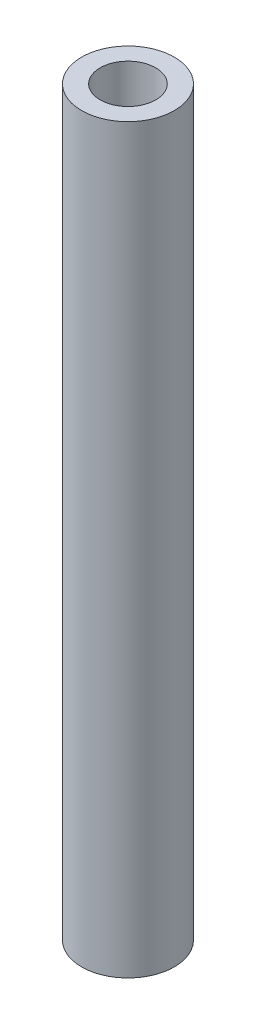
ISO-10303-21;
HEADER;
FILE_DESCRIPTION(('STEP AP214'),'2;1');
FILE_NAME('part.step','',(''),(''),'','','');
FILE_SCHEMA(('AUTOMOTIVE_DESIGN { 1 0 10303 214 1 1 1 1 }'));
ENDSEC;
DATA;
#1=APPLICATION_CONTEXT('core data for automotive mechanical design processes');
#2=APPLICATION_PROTOCOL_DEFINITION('international standard','automotive_design',2000,#1);
#3=PRODUCT_CONTEXT('',#1,'mechanical');
#4=PRODUCT('Part','Part','',(#3));
#5=PRODUCT_RELATED_PRODUCT_CATEGORY('part','',(#4));
#6=PRODUCT_DEFINITION_FORMATION('','',#4);
#7=PRODUCT_DEFINITION_CONTEXT('part definition',#1,'design');
#8=PRODUCT_DEFINITION('design','',#6,#7);
#9=PRODUCT_DEFINITION_SHAPE('','',#8);
#10=(LENGTH_UNIT() NAMED_UNIT(*) SI_UNIT(.MILLI.,.METRE.));
#11=(NAMED_UNIT(*) PLANE_ANGLE_UNIT() SI_UNIT($,.RADIAN.));
#12=(NAMED_UNIT(*) SI_UNIT($,.STERADIAN.) SOLID_ANGLE_UNIT());
#13=UNCERTAINTY_MEASURE_WITH_UNIT(LENGTH_MEASURE(1.E-05),#10,'distance_accuracy_value','');
#14=(GEOMETRIC_REPRESENTATION_CONTEXT(3) GLOBAL_UNCERTAINTY_ASSIGNED_CONTEXT((#13)) GLOBAL_UNIT_ASSIGNED_CONTEXT((#10,
#11,#12)) REPRESENTATION_CONTEXT('',''));
#15=CARTESIAN_POINT('',(0.,0.,0.));
#16=DIRECTION('',(0.,0.,1.));
#17=DIRECTION('',(1.,0.,0.));
#18=AXIS2_PLACEMENT_3D('',#15,#16,#17);
#19=CARTESIAN_POINT('',(0.,80.,0.));
#20=DIRECTION('',(0.,-1.,0.));
#21=DIRECTION('',(0.,0.,-1.));
#22=AXIS2_PLACEMENT_3D('',#19,#20,#21);
#23=CYLINDRICAL_SURFACE('',#22,5.);
#24=CARTESIAN_POINT('',(0.,80.,0.));
#25=DIRECTION('',(0.,1.,0.));
#26=DIRECTION('',(0.,0.,1.));
#27=AXIS2_PLACEMENT_3D('',#24,#25,#26);
#28=CIRCLE('',#27,5.);
#29=CARTESIAN_POINT('',(0.,80.,5.));
#30=VERTEX_POINT('',#29);
#31=EDGE_CURVE('E10',#30,#30,#28,.T.);
#32=ORIENTED_EDGE('',*,*,#31,.F.);
#33=EDGE_LOOP('',(#32));
#34=FACE_BOUND('',#33,.T.);
#35=CARTESIAN_POINT('',(0.,0.,0.));
#36=DIRECTION('',(0.,1.,0.));
#37=DIRECTION('',(0.,0.,1.));
#38=AXIS2_PLACEMENT_3D('',#35,#36,#37);
#39=CIRCLE('',#38,5.);
#40=CARTESIAN_POINT('',(0.,0.,5.));
#41=VERTEX_POINT('',#40);
#42=EDGE_CURVE('E34',#41,#41,#39,.T.);
#43=ORIENTED_EDGE('',*,*,#42,.T.);
#44=EDGE_LOOP('',(#43));
#45=FACE_BOUND('',#44,.T.);
#46=ADVANCED_FACE('F31',(#34,#45),#23,.T.);
#47=CARTESIAN_POINT('',(0.,80.,0.));
#48=DIRECTION('',(0.,1.,0.));
#49=DIRECTION('',(0.,0.,1.));
#50=AXIS2_PLACEMENT_3D('',#47,#48,#49);
#51=PLANE('',#50);
#52=CARTESIAN_POINT('',(0.,80.,0.));
#53=DIRECTION('',(0.,1.,0.));
#54=DIRECTION('',(0.,0.,1.));
#55=AXIS2_PLACEMENT_3D('',#52,#53,#54);
#56=CIRCLE('',#55,3.);
#57=CARTESIAN_POINT('',(0.,80.,3.));
#58=VERTEX_POINT('',#57);
#59=EDGE_CURVE('E43',#58,#58,#56,.T.);
#60=ORIENTED_EDGE('',*,*,#59,.F.);
#61=EDGE_LOOP('',(#60));
#62=FACE_BOUND('',#61,.T.);
#63=ORIENTED_EDGE('',*,*,#31,.T.);
#64=EDGE_LOOP('',(#63));
#65=FACE_BOUND('',#64,.T.);
#66=ADVANCED_FACE('F68',(#62,#65),#51,.T.);
#67=CARTESIAN_POINT('',(0.,0.,0.));
#68=DIRECTION('',(0.,1.,0.));
#69=DIRECTION('',(0.,0.,1.));
#70=AXIS2_PLACEMENT_3D('',#67,#68,#69);
#71=PLANE('',#70);
#72=CARTESIAN_POINT('',(0.,0.,0.));
#73=DIRECTION('',(0.,-1.,0.));
#74=DIRECTION('',(0.,0.,-1.));
#75=AXIS2_PLACEMENT_3D('',#72,#73,#74);
#76=CIRCLE('',#75,1.55);
#77=CARTESIAN_POINT('',(0.,0.,-1.55));
#78=VERTEX_POINT('',#77);
#79=EDGE_CURVE('E49',#78,#78,#76,.T.);
#80=ORIENTED_EDGE('',*,*,#79,.F.);
#81=EDGE_LOOP('',(#80));
#82=FACE_BOUND('',#81,.T.);
#83=ORIENTED_EDGE('',*,*,#42,.F.);
#84=EDGE_LOOP('',(#83));
#85=FACE_BOUND('',#84,.T.);
#86=ADVANCED_FACE('F64',(#82,#85),#71,.F.);
#87=CARTESIAN_POINT('',(0.,5.,0.));
#88=DIRECTION('',(0.,1.,0.));
#89=DIRECTION('',(0.,0.,1.));
#90=AXIS2_PLACEMENT_3D('',#87,#88,#89);
#91=CYLINDRICAL_SURFACE('',#90,3.);
#92=CARTESIAN_POINT('',(0.,5.,0.));
#93=DIRECTION('',(0.,1.,0.));
#94=DIRECTION('',(0.,0.,1.));
#95=AXIS2_PLACEMENT_3D('',#92,#93,#94);
#96=CIRCLE('',#95,3.);
#97=CARTESIAN_POINT('',(0.,5.,3.));
#98=VERTEX_POINT('',#97);
#99=EDGE_CURVE('E41',#98,#98,#96,.T.);
#100=ORIENTED_EDGE('',*,*,#99,.F.);
#101=EDGE_LOOP('',(#100));
#102=FACE_BOUND('',#101,.T.);
#103=ORIENTED_EDGE('',*,*,#59,.T.);
#104=EDGE_LOOP('',(#103));
#105=FACE_BOUND('',#104,.T.);
#106=ADVANCED_FACE('F67',(#102,#105),#91,.F.);
#107=CARTESIAN_POINT('',(0.,5.,0.));
#108=DIRECTION('',(0.,1.,0.));
#109=DIRECTION('',(0.,0.,1.));
#110=AXIS2_PLACEMENT_3D('',#107,#108,#109);
#111=PLANE('',#110);
#112=CARTESIAN_POINT('',(0.,5.,0.));
#113=DIRECTION('',(0.,-1.,0.));
#114=DIRECTION('',(0.,0.,-1.));
#115=AXIS2_PLACEMENT_3D('',#112,#113,#114);
#116=CIRCLE('',#115,1.55);
#117=CARTESIAN_POINT('',(0.,5.,-1.55));
#118=VERTEX_POINT('',#117);
#119=EDGE_CURVE('E46',#118,#118,#116,.T.);
#120=ORIENTED_EDGE('',*,*,#119,.T.);
#121=EDGE_LOOP('',(#120));
#122=FACE_BOUND('',#121,.T.);
#123=ORIENTED_EDGE('',*,*,#99,.T.);
#124=EDGE_LOOP('',(#123));
#125=FACE_BOUND('',#124,.T.);
#126=ADVANCED_FACE('F55',(#122,#125),#111,.T.);
#127=CARTESIAN_POINT('',(0.,5.,0.));
#128=DIRECTION('',(0.,-1.,0.));
#129=DIRECTION('',(0.,0.,-1.));
#130=AXIS2_PLACEMENT_3D('',#127,#128,#129);
#131=CYLINDRICAL_SURFACE('',#130,1.55);
#132=ORIENTED_EDGE('',*,*,#119,.F.);
#133=EDGE_LOOP('',(#132));
#134=FACE_BOUND('',#133,.T.);
#135=ORIENTED_EDGE('',*,*,#79,.T.);
#136=EDGE_LOOP('',(#135));
#137=FACE_BOUND('',#136,.T.);
#138=ADVANCED_FACE('F58',(#134,#137),#131,.F.);
#139=CLOSED_SHELL('',(#46,#66,#86,#106,#126,#138));
#140=MANIFOLD_SOLID_BREP('B2',#139);
#141=ADVANCED_BREP_SHAPE_REPRESENTATION('',(#18,#140),#14);
#142=SHAPE_DEFINITION_REPRESENTATION(#9,#141);
ENDSEC;
END-ISO-10303-21;
